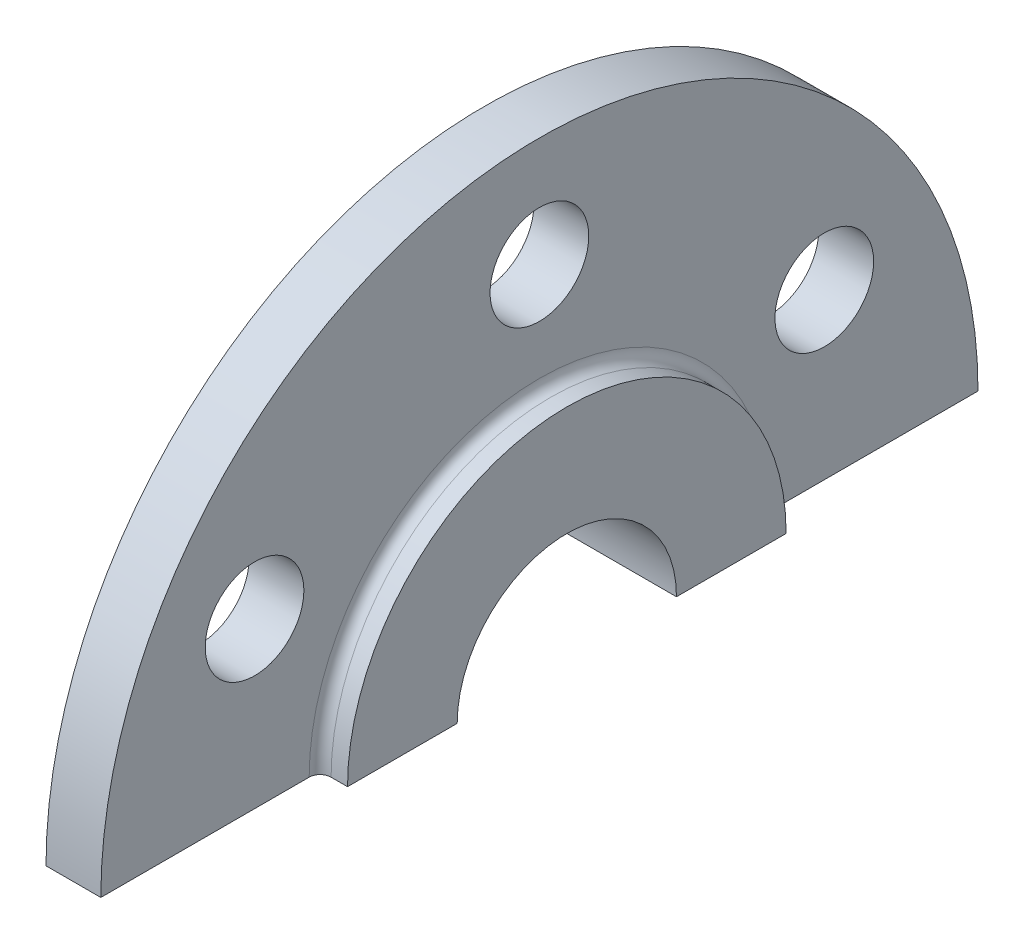
ISO-10303-21;
HEADER;
FILE_DESCRIPTION(('STEP AP214'),'2;1');
FILE_NAME('part.step','',(''),(''),'','','');
FILE_SCHEMA(('AUTOMOTIVE_DESIGN { 1 0 10303 214 1 1 1 1 }'));
ENDSEC;
DATA;
#1=APPLICATION_CONTEXT('core data for automotive mechanical design processes');
#2=APPLICATION_PROTOCOL_DEFINITION('international standard','automotive_design',2000,#1);
#3=PRODUCT_CONTEXT('',#1,'mechanical');
#4=PRODUCT('Part','Part','',(#3));
#5=PRODUCT_RELATED_PRODUCT_CATEGORY('part','',(#4));
#6=PRODUCT_DEFINITION_FORMATION('','',#4);
#7=PRODUCT_DEFINITION_CONTEXT('part definition',#1,'design');
#8=PRODUCT_DEFINITION('design','',#6,#7);
#9=PRODUCT_DEFINITION_SHAPE('','',#8);
#10=(LENGTH_UNIT() NAMED_UNIT(*) SI_UNIT(.MILLI.,.METRE.));
#11=(NAMED_UNIT(*) PLANE_ANGLE_UNIT() SI_UNIT($,.RADIAN.));
#12=(NAMED_UNIT(*) SI_UNIT($,.STERADIAN.) SOLID_ANGLE_UNIT());
#13=UNCERTAINTY_MEASURE_WITH_UNIT(LENGTH_MEASURE(1.E-05),#10,'distance_accuracy_value','');
#14=(GEOMETRIC_REPRESENTATION_CONTEXT(3) GLOBAL_UNCERTAINTY_ASSIGNED_CONTEXT((#13)) GLOBAL_UNIT_ASSIGNED_CONTEXT((#10,
#11,#12)) REPRESENTATION_CONTEXT('',''));
#15=CARTESIAN_POINT('',(0.,0.,0.));
#16=DIRECTION('',(0.,0.,1.));
#17=DIRECTION('',(1.,0.,0.));
#18=AXIS2_PLACEMENT_3D('',#15,#16,#17);
#19=CARTESIAN_POINT('',(-0.5,0.,0.));
#20=DIRECTION('',(-1.,0.,0.));
#21=DIRECTION('',(0.,0.,1.));
#22=AXIS2_PLACEMENT_3D('',#19,#20,#21);
#23=CYLINDRICAL_SURFACE('',#22,80.);
#24=CARTESIAN_POINT('',(-5.,0.,0.));
#25=DIRECTION('',(-1.,0.,0.));
#26=DIRECTION('',(0.,0.,1.));
#27=AXIS2_PLACEMENT_3D('',#24,#25,#26);
#28=CIRCLE('',#27,80.);
#29=CARTESIAN_POINT('',(-5.,-5.58637014214901E-13,80.));
#30=VERTEX_POINT('',#29);
#31=CARTESIAN_POINT('',(-5.,0.,-80.));
#32=VERTEX_POINT('',#31);
#33=EDGE_CURVE('E124',#30,#32,#28,.T.);
#34=ORIENTED_EDGE('',*,*,#33,.F.);
#35=DIRECTION('',(1.,0.,0.));
#36=VECTOR('',#35,1.);
#37=CARTESIAN_POINT('',(0.,-5.58637014214901E-13,80.));
#38=LINE('',#37,#36);
#39=CARTESIAN_POINT('',(5.,-5.58637014214901E-13,80.));
#40=VERTEX_POINT('',#39);
#41=EDGE_CURVE('E155',#30,#40,#38,.T.);
#42=ORIENTED_EDGE('',*,*,#41,.T.);
#43=CARTESIAN_POINT('',(5.,0.,0.));
#44=DIRECTION('',(-1.,0.,0.));
#45=DIRECTION('',(0.,0.,1.));
#46=AXIS2_PLACEMENT_3D('',#43,#44,#45);
#47=CIRCLE('',#46,80.);
#48=CARTESIAN_POINT('',(5.,0.,-80.));
#49=VERTEX_POINT('',#48);
#50=EDGE_CURVE('E133',#40,#49,#47,.T.);
#51=ORIENTED_EDGE('',*,*,#50,.T.);
#52=DIRECTION('',(1.,0.,0.));
#53=VECTOR('',#52,1.);
#54=CARTESIAN_POINT('',(0.,0.,-80.));
#55=LINE('',#54,#53);
#56=EDGE_CURVE('E119',#32,#49,#55,.T.);
#57=ORIENTED_EDGE('',*,*,#56,.F.);
#58=EDGE_LOOP('',(#34,#42,#51,#57));
#59=FACE_BOUND('',#58,.T.);
#60=ADVANCED_FACE('F41',(#59),#23,.T.);
#61=CARTESIAN_POINT('',(-5.,0.,0.));
#62=DIRECTION('',(-1.,0.,0.));
#63=DIRECTION('',(0.,0.,1.));
#64=AXIS2_PLACEMENT_3D('',#61,#62,#63);
#65=PLANE('',#64);
#66=CARTESIAN_POINT('',(-5.,29.9999999999999,51.9615242270664));
#67=DIRECTION('',(-1.,0.,0.));
#68=DIRECTION('',(0.,0.,1.));
#69=AXIS2_PLACEMENT_3D('',#66,#67,#68);
#70=CIRCLE('',#69,9.);
#71=CARTESIAN_POINT('',(-5.,29.9999999999999,60.9615242270664));
#72=VERTEX_POINT('',#71);
#73=EDGE_CURVE('E134',#72,#72,#70,.T.);
#74=ORIENTED_EDGE('',*,*,#73,.F.);
#75=EDGE_LOOP('',(#74));
#76=FACE_BOUND('',#75,.T.);
#77=CARTESIAN_POINT('',(-5.,60.,0.));
#78=DIRECTION('',(-1.,0.,0.));
#79=DIRECTION('',(0.,0.,1.));
#80=AXIS2_PLACEMENT_3D('',#77,#78,#79);
#81=CIRCLE('',#80,9.);
#82=CARTESIAN_POINT('',(-5.,60.,9.));
#83=VERTEX_POINT('',#82);
#84=EDGE_CURVE('E191',#83,#83,#81,.T.);
#85=ORIENTED_EDGE('',*,*,#84,.F.);
#86=EDGE_LOOP('',(#85));
#87=FACE_BOUND('',#86,.T.);
#88=CARTESIAN_POINT('',(-5.,29.9999999999999,-51.9615242270664));
#89=DIRECTION('',(-1.,0.,0.));
#90=DIRECTION('',(0.,0.,1.));
#91=AXIS2_PLACEMENT_3D('',#88,#89,#90);
#92=CIRCLE('',#91,9.00000000000001);
#93=CARTESIAN_POINT('',(-5.,29.9999999999999,-42.9615242270664));
#94=VERTEX_POINT('',#93);
#95=EDGE_CURVE('E187',#94,#94,#92,.T.);
#96=ORIENTED_EDGE('',*,*,#95,.F.);
#97=EDGE_LOOP('',(#96));
#98=FACE_BOUND('',#97,.T.);
#99=DIRECTION('',(0.,0.,-1.));
#100=VECTOR('',#99,1.);
#101=CARTESIAN_POINT('',(-5.,0.,0.));
#102=LINE('',#101,#100);
#103=CARTESIAN_POINT('',(-5.,0.,-42.));
#104=VERTEX_POINT('',#103);
#105=EDGE_CURVE('E114',#104,#32,#102,.T.);
#106=ORIENTED_EDGE('',*,*,#105,.F.);
#107=CARTESIAN_POINT('',(-5.,0.,0.));
#108=DIRECTION('',(-1.,0.,0.));
#109=DIRECTION('',(0.,0.,1.));
#110=AXIS2_PLACEMENT_3D('',#107,#108,#109);
#111=CIRCLE('',#110,42.);
#112=CARTESIAN_POINT('',(-5.,-2.93284432462823E-13,42.));
#113=VERTEX_POINT('',#112);
#114=EDGE_CURVE('E62',#104,#113,#111,.F.);
#115=ORIENTED_EDGE('',*,*,#114,.T.);
#116=DIRECTION('',(0.,0.,1.));
#117=VECTOR('',#116,1.);
#118=CARTESIAN_POINT('',(-5.,0.,0.));
#119=LINE('',#118,#117);
#120=EDGE_CURVE('E126',#113,#30,#119,.T.);
#121=ORIENTED_EDGE('',*,*,#120,.T.);
#122=ORIENTED_EDGE('',*,*,#33,.T.);
#123=EDGE_LOOP('',(#106,#115,#121,#122));
#124=FACE_BOUND('',#123,.T.);
#125=ADVANCED_FACE('F125',(#76,#87,#98,#124),#65,.T.);
#126=CARTESIAN_POINT('',(-0.5,0.,0.));
#127=DIRECTION('',(-1.,0.,0.));
#128=DIRECTION('',(0.,0.,1.));
#129=AXIS2_PLACEMENT_3D('',#126,#127,#128);
#130=CYLINDRICAL_SURFACE('',#129,40.);
#131=DIRECTION('',(1.,0.,0.));
#132=VECTOR('',#131,1.);
#133=CARTESIAN_POINT('',(0.,-2.79318507107451E-13,40.));
#134=LINE('',#133,#132);
#135=CARTESIAN_POINT('',(-10.,-2.79318507107451E-13,40.));
#136=VERTEX_POINT('',#135);
#137=CARTESIAN_POINT('',(-7.,-2.79318507107451E-13,40.));
#138=VERTEX_POINT('',#137);
#139=EDGE_CURVE('E158',#136,#138,#134,.T.);
#140=ORIENTED_EDGE('',*,*,#139,.T.);
#141=CARTESIAN_POINT('',(-7.,0.,0.));
#142=DIRECTION('',(-1.,0.,0.));
#143=DIRECTION('',(0.,0.,1.));
#144=AXIS2_PLACEMENT_3D('',#141,#142,#143);
#145=CIRCLE('',#144,40.);
#146=CARTESIAN_POINT('',(-7.,0.,-40.));
#147=VERTEX_POINT('',#146);
#148=EDGE_CURVE('E198',#138,#147,#145,.T.);
#149=ORIENTED_EDGE('',*,*,#148,.T.);
#150=DIRECTION('',(1.,0.,0.));
#151=VECTOR('',#150,1.);
#152=CARTESIAN_POINT('',(0.,0.,-40.));
#153=LINE('',#152,#151);
#154=CARTESIAN_POINT('',(-10.,0.,-40.));
#155=VERTEX_POINT('',#154);
#156=EDGE_CURVE('E121',#155,#147,#153,.T.);
#157=ORIENTED_EDGE('',*,*,#156,.F.);
#158=CARTESIAN_POINT('',(-10.,0.,0.));
#159=DIRECTION('',(-1.,0.,0.));
#160=DIRECTION('',(0.,0.,1.));
#161=AXIS2_PLACEMENT_3D('',#158,#159,#160);
#162=CIRCLE('',#161,40.);
#163=EDGE_CURVE('E131',#136,#155,#162,.T.);
#164=ORIENTED_EDGE('',*,*,#163,.F.);
#165=EDGE_LOOP('',(#140,#149,#157,#164));
#166=FACE_BOUND('',#165,.T.);
#167=ADVANCED_FACE('F235',(#166),#130,.T.);
#168=CARTESIAN_POINT('',(-10.,0.,0.));
#169=DIRECTION('',(-1.,0.,0.));
#170=DIRECTION('',(0.,0.,1.));
#171=AXIS2_PLACEMENT_3D('',#168,#169,#170);
#172=PLANE('',#171);
#173=CARTESIAN_POINT('',(-10.,0.,0.));
#174=DIRECTION('',(-1.,0.,0.));
#175=DIRECTION('',(0.,0.,1.));
#176=AXIS2_PLACEMENT_3D('',#173,#174,#175);
#177=CIRCLE('',#176,20.);
#178=CARTESIAN_POINT('',(-10.,-1.39659253553725E-13,20.));
#179=VERTEX_POINT('',#178);
#180=CARTESIAN_POINT('',(-10.,0.,-20.));
#181=VERTEX_POINT('',#180);
#182=EDGE_CURVE('E181',#179,#181,#177,.T.);
#183=ORIENTED_EDGE('',*,*,#182,.F.);
#184=DIRECTION('',(0.,0.,1.));
#185=VECTOR('',#184,1.);
#186=CARTESIAN_POINT('',(-9.99999999999999,0.,0.));
#187=LINE('',#186,#185);
#188=EDGE_CURVE('E161',#179,#136,#187,.T.);
#189=ORIENTED_EDGE('',*,*,#188,.T.);
#190=ORIENTED_EDGE('',*,*,#163,.T.);
#191=DIRECTION('',(0.,0.,-1.));
#192=VECTOR('',#191,1.);
#193=CARTESIAN_POINT('',(-9.99999999999999,0.,0.));
#194=LINE('',#193,#192);
#195=EDGE_CURVE('E142',#181,#155,#194,.T.);
#196=ORIENTED_EDGE('',*,*,#195,.F.);
#197=EDGE_LOOP('',(#183,#189,#190,#196));
#198=FACE_BOUND('',#197,.T.);
#199=ADVANCED_FACE('F231',(#198),#172,.T.);
#200=CARTESIAN_POINT('',(-0.5,0.,0.));
#201=DIRECTION('',(-1.,0.,0.));
#202=DIRECTION('',(0.,0.,1.));
#203=AXIS2_PLACEMENT_3D('',#200,#201,#202);
#204=CYLINDRICAL_SURFACE('',#203,20.);
#205=CARTESIAN_POINT('',(10.,0.,0.));
#206=DIRECTION('',(-1.,0.,0.));
#207=DIRECTION('',(0.,0.,1.));
#208=AXIS2_PLACEMENT_3D('',#205,#206,#207);
#209=CIRCLE('',#208,20.);
#210=CARTESIAN_POINT('',(10.,-1.39659253553725E-13,20.));
#211=VERTEX_POINT('',#210);
#212=CARTESIAN_POINT('',(10.,0.,-20.));
#213=VERTEX_POINT('',#212);
#214=EDGE_CURVE('E179',#211,#213,#209,.T.);
#215=ORIENTED_EDGE('',*,*,#214,.F.);
#216=DIRECTION('',(-1.,0.,0.));
#217=VECTOR('',#216,1.);
#218=CARTESIAN_POINT('',(0.,-1.39659253553725E-13,20.));
#219=LINE('',#218,#217);
#220=EDGE_CURVE('E164',#211,#179,#219,.T.);
#221=ORIENTED_EDGE('',*,*,#220,.T.);
#222=ORIENTED_EDGE('',*,*,#182,.T.);
#223=DIRECTION('',(-1.,0.,0.));
#224=VECTOR('',#223,1.);
#225=CARTESIAN_POINT('',(0.,0.,-20.));
#226=LINE('',#225,#224);
#227=EDGE_CURVE('E145',#213,#181,#226,.T.);
#228=ORIENTED_EDGE('',*,*,#227,.F.);
#229=EDGE_LOOP('',(#215,#221,#222,#228));
#230=FACE_BOUND('',#229,.T.);
#231=ADVANCED_FACE('F227',(#230),#204,.F.);
#232=CARTESIAN_POINT('',(10.,0.,0.));
#233=DIRECTION('',(1.,0.,0.));
#234=DIRECTION('',(0.,0.,-1.));
#235=AXIS2_PLACEMENT_3D('',#232,#233,#234);
#236=PLANE('',#235);
#237=CARTESIAN_POINT('',(10.,0.,0.));
#238=DIRECTION('',(-1.,0.,0.));
#239=DIRECTION('',(0.,0.,1.));
#240=AXIS2_PLACEMENT_3D('',#237,#238,#239);
#241=CIRCLE('',#240,40.);
#242=CARTESIAN_POINT('',(10.,-2.79318507107451E-13,40.));
#243=VERTEX_POINT('',#242);
#244=CARTESIAN_POINT('',(10.,0.,-40.));
#245=VERTEX_POINT('',#244);
#246=EDGE_CURVE('E176',#243,#245,#241,.T.);
#247=ORIENTED_EDGE('',*,*,#246,.F.);
#248=DIRECTION('',(0.,0.,-1.));
#249=VECTOR('',#248,1.);
#250=CARTESIAN_POINT('',(10.,0.,0.));
#251=LINE('',#250,#249);
#252=EDGE_CURVE('E167',#243,#211,#251,.T.);
#253=ORIENTED_EDGE('',*,*,#252,.T.);
#254=ORIENTED_EDGE('',*,*,#214,.T.);
#255=DIRECTION('',(0.,0.,1.));
#256=VECTOR('',#255,1.);
#257=CARTESIAN_POINT('',(10.,0.,0.));
#258=LINE('',#257,#256);
#259=EDGE_CURVE('E148',#245,#213,#258,.T.);
#260=ORIENTED_EDGE('',*,*,#259,.F.);
#261=EDGE_LOOP('',(#247,#253,#254,#260));
#262=FACE_BOUND('',#261,.T.);
#263=ADVANCED_FACE('F223',(#262),#236,.T.);
#264=CARTESIAN_POINT('',(-0.5,0.,0.));
#265=DIRECTION('',(-1.,0.,0.));
#266=DIRECTION('',(0.,0.,1.));
#267=AXIS2_PLACEMENT_3D('',#264,#265,#266);
#268=CYLINDRICAL_SURFACE('',#267,40.);
#269=DIRECTION('',(1.,0.,0.));
#270=VECTOR('',#269,1.);
#271=CARTESIAN_POINT('',(0.,0.,-40.));
#272=LINE('',#271,#270);
#273=CARTESIAN_POINT('',(7.,0.,-40.));
#274=VERTEX_POINT('',#273);
#275=EDGE_CURVE('E151',#274,#245,#272,.T.);
#276=ORIENTED_EDGE('',*,*,#275,.F.);
#277=CARTESIAN_POINT('',(7.,0.,0.));
#278=DIRECTION('',(1.,0.,0.));
#279=DIRECTION('',(0.,0.,-1.));
#280=AXIS2_PLACEMENT_3D('',#277,#278,#279);
#281=CIRCLE('',#280,40.);
#282=CARTESIAN_POINT('',(7.,-2.79318507107451E-13,40.));
#283=VERTEX_POINT('',#282);
#284=EDGE_CURVE('E196',#274,#283,#281,.T.);
#285=ORIENTED_EDGE('',*,*,#284,.T.);
#286=DIRECTION('',(1.,0.,0.));
#287=VECTOR('',#286,1.);
#288=CARTESIAN_POINT('',(0.,-2.79318507107451E-13,40.));
#289=LINE('',#288,#287);
#290=EDGE_CURVE('E170',#283,#243,#289,.T.);
#291=ORIENTED_EDGE('',*,*,#290,.T.);
#292=ORIENTED_EDGE('',*,*,#246,.T.);
#293=EDGE_LOOP('',(#276,#285,#291,#292));
#294=FACE_BOUND('',#293,.T.);
#295=ADVANCED_FACE('F219',(#294),#268,.T.);
#296=CARTESIAN_POINT('',(5.,0.,0.));
#297=DIRECTION('',(1.,0.,0.));
#298=DIRECTION('',(0.,0.,-1.));
#299=AXIS2_PLACEMENT_3D('',#296,#297,#298);
#300=PLANE('',#299);
#301=CARTESIAN_POINT('',(5.,29.9999999999999,51.9615242270664));
#302=DIRECTION('',(1.,0.,0.));
#303=DIRECTION('',(0.,0.,-1.));
#304=AXIS2_PLACEMENT_3D('',#301,#302,#303);
#305=CIRCLE('',#304,9.);
#306=CARTESIAN_POINT('',(5.,29.9999999999999,42.9615242270664));
#307=VERTEX_POINT('',#306);
#308=EDGE_CURVE('E137',#307,#307,#305,.T.);
#309=ORIENTED_EDGE('',*,*,#308,.F.);
#310=EDGE_LOOP('',(#309));
#311=FACE_BOUND('',#310,.T.);
#312=CARTESIAN_POINT('',(5.,60.,0.));
#313=DIRECTION('',(1.,0.,0.));
#314=DIRECTION('',(0.,0.,-1.));
#315=AXIS2_PLACEMENT_3D('',#312,#313,#314);
#316=CIRCLE('',#315,9.);
#317=CARTESIAN_POINT('',(5.,60.,-9.));
#318=VERTEX_POINT('',#317);
#319=EDGE_CURVE('E188',#318,#318,#316,.T.);
#320=ORIENTED_EDGE('',*,*,#319,.F.);
#321=EDGE_LOOP('',(#320));
#322=FACE_BOUND('',#321,.T.);
#323=CARTESIAN_POINT('',(5.,29.9999999999999,-51.9615242270664));
#324=DIRECTION('',(1.,0.,0.));
#325=DIRECTION('',(0.,0.,-1.));
#326=AXIS2_PLACEMENT_3D('',#323,#324,#325);
#327=CIRCLE('',#326,9.00000000000001);
#328=CARTESIAN_POINT('',(5.,29.9999999999999,-60.9615242270664));
#329=VERTEX_POINT('',#328);
#330=EDGE_CURVE('E184',#329,#329,#327,.T.);
#331=ORIENTED_EDGE('',*,*,#330,.F.);
#332=EDGE_LOOP('',(#331));
#333=FACE_BOUND('',#332,.T.);
#334=DIRECTION('',(0.,0.,-1.));
#335=VECTOR('',#334,1.);
#336=CARTESIAN_POINT('',(5.00000000000001,0.,0.));
#337=LINE('',#336,#335);
#338=CARTESIAN_POINT('',(5.00000000000001,-2.93284432462823E-13,42.));
#339=VERTEX_POINT('',#338);
#340=EDGE_CURVE('E172',#40,#339,#337,.T.);
#341=ORIENTED_EDGE('',*,*,#340,.T.);
#342=CARTESIAN_POINT('',(5.,0.,0.));
#343=DIRECTION('',(1.,0.,0.));
#344=DIRECTION('',(0.,0.,-1.));
#345=AXIS2_PLACEMENT_3D('',#342,#343,#344);
#346=CIRCLE('',#345,42.);
#347=CARTESIAN_POINT('',(5.00000000000001,0.,-42.));
#348=VERTEX_POINT('',#347);
#349=EDGE_CURVE('E130',#339,#348,#346,.F.);
#350=ORIENTED_EDGE('',*,*,#349,.T.);
#351=DIRECTION('',(0.,0.,1.));
#352=VECTOR('',#351,1.);
#353=CARTESIAN_POINT('',(5.00000000000001,0.,0.));
#354=LINE('',#353,#352);
#355=EDGE_CURVE('E153',#49,#348,#354,.T.);
#356=ORIENTED_EDGE('',*,*,#355,.F.);
#357=ORIENTED_EDGE('',*,*,#50,.F.);
#358=EDGE_LOOP('',(#341,#350,#356,#357));
#359=FACE_BOUND('',#358,.T.);
#360=ADVANCED_FACE('F215',(#311,#322,#333,#359),#300,.T.);
#361=CARTESIAN_POINT('',(0.,0.,0.));
#362=DIRECTION('',(0.,-1.,0.));
#363=DIRECTION('',(0.,0.,-1.));
#364=AXIS2_PLACEMENT_3D('',#361,#362,#363);
#365=PLANE('',#364);
#366=ORIENTED_EDGE('',*,*,#41,.F.);
#367=ORIENTED_EDGE('',*,*,#120,.F.);
#368=CARTESIAN_POINT('',(-7.,-2.93284432462823E-13,42.));
#369=DIRECTION('',(0.,-1.,0.));
#370=DIRECTION('',(0.,0.,-1.));
#371=AXIS2_PLACEMENT_3D('',#368,#369,#370);
#372=CIRCLE('',#371,2.);
#373=EDGE_CURVE('E11',#113,#138,#372,.F.);
#374=ORIENTED_EDGE('',*,*,#373,.T.);
#375=ORIENTED_EDGE('',*,*,#139,.F.);
#376=ORIENTED_EDGE('',*,*,#188,.F.);
#377=ORIENTED_EDGE('',*,*,#220,.F.);
#378=ORIENTED_EDGE('',*,*,#252,.F.);
#379=ORIENTED_EDGE('',*,*,#290,.F.);
#380=CARTESIAN_POINT('',(7.,-2.93284432462823E-13,42.));
#381=DIRECTION('',(0.,-1.,0.));
#382=DIRECTION('',(0.,0.,-1.));
#383=AXIS2_PLACEMENT_3D('',#380,#381,#382);
#384=CIRCLE('',#383,2.);
#385=EDGE_CURVE('E204',#283,#339,#384,.F.);
#386=ORIENTED_EDGE('',*,*,#385,.T.);
#387=ORIENTED_EDGE('',*,*,#340,.F.);
#388=EDGE_LOOP('',(#366,#367,#374,#375,#376,#377,#378,#379,#386,#387));
#389=FACE_BOUND('',#388,.T.);
#390=ADVANCED_FACE('F209',(#389),#365,.T.);
#391=CARTESIAN_POINT('',(0.,0.,0.));
#392=DIRECTION('',(0.,1.,0.));
#393=DIRECTION('',(0.,0.,1.));
#394=AXIS2_PLACEMENT_3D('',#391,#392,#393);
#395=PLANE('',#394);
#396=ORIENTED_EDGE('',*,*,#56,.T.);
#397=ORIENTED_EDGE('',*,*,#355,.T.);
#398=CARTESIAN_POINT('',(7.,0.,-42.));
#399=DIRECTION('',(0.,1.,0.));
#400=DIRECTION('',(0.,0.,1.));
#401=AXIS2_PLACEMENT_3D('',#398,#399,#400);
#402=CIRCLE('',#401,2.);
#403=EDGE_CURVE('E202',#348,#274,#402,.T.);
#404=ORIENTED_EDGE('',*,*,#403,.T.);
#405=ORIENTED_EDGE('',*,*,#275,.T.);
#406=ORIENTED_EDGE('',*,*,#259,.T.);
#407=ORIENTED_EDGE('',*,*,#227,.T.);
#408=ORIENTED_EDGE('',*,*,#195,.T.);
#409=ORIENTED_EDGE('',*,*,#156,.T.);
#410=CARTESIAN_POINT('',(-7.,0.,-42.));
#411=DIRECTION('',(0.,1.,0.));
#412=DIRECTION('',(0.,0.,1.));
#413=AXIS2_PLACEMENT_3D('',#410,#411,#412);
#414=CIRCLE('',#413,2.);
#415=EDGE_CURVE('E49',#147,#104,#414,.T.);
#416=ORIENTED_EDGE('',*,*,#415,.T.);
#417=ORIENTED_EDGE('',*,*,#105,.T.);
#418=EDGE_LOOP('',(#396,#397,#404,#405,#406,#407,#408,#409,#416,#417));
#419=FACE_BOUND('',#418,.T.);
#420=ADVANCED_FACE('F116',(#419),#395,.F.);
#421=CARTESIAN_POINT('',(-10.,29.9999999999999,-51.9615242270664));
#422=DIRECTION('',(1.,0.,0.));
#423=DIRECTION('',(0.,0.,-1.));
#424=AXIS2_PLACEMENT_3D('',#421,#422,#423);
#425=CYLINDRICAL_SURFACE('',#424,9.00000000000001);
#426=ORIENTED_EDGE('',*,*,#95,.T.);
#427=EDGE_LOOP('',(#426));
#428=FACE_BOUND('',#427,.T.);
#429=ORIENTED_EDGE('',*,*,#330,.T.);
#430=EDGE_LOOP('',(#429));
#431=FACE_BOUND('',#430,.T.);
#432=ADVANCED_FACE('F296',(#428,#431),#425,.F.);
#433=CARTESIAN_POINT('',(-10.,60.,0.));
#434=DIRECTION('',(1.,0.,0.));
#435=DIRECTION('',(0.,0.,-1.));
#436=AXIS2_PLACEMENT_3D('',#433,#434,#435);
#437=CYLINDRICAL_SURFACE('',#436,9.);
#438=ORIENTED_EDGE('',*,*,#84,.T.);
#439=EDGE_LOOP('',(#438));
#440=FACE_BOUND('',#439,.T.);
#441=ORIENTED_EDGE('',*,*,#319,.T.);
#442=EDGE_LOOP('',(#441));
#443=FACE_BOUND('',#442,.T.);
#444=ADVANCED_FACE('F315',(#440,#443),#437,.F.);
#445=CARTESIAN_POINT('',(-10.,29.9999999999999,51.9615242270664));
#446=DIRECTION('',(1.,0.,0.));
#447=DIRECTION('',(0.,0.,-1.));
#448=AXIS2_PLACEMENT_3D('',#445,#446,#447);
#449=CYLINDRICAL_SURFACE('',#448,9.);
#450=ORIENTED_EDGE('',*,*,#73,.T.);
#451=EDGE_LOOP('',(#450));
#452=FACE_BOUND('',#451,.T.);
#453=ORIENTED_EDGE('',*,*,#308,.T.);
#454=EDGE_LOOP('',(#453));
#455=FACE_BOUND('',#454,.T.);
#456=ADVANCED_FACE('F243',(#452,#455),#449,.F.);
#457=CARTESIAN_POINT('',(7.,0.,0.));
#458=DIRECTION('',(1.,0.,0.));
#459=DIRECTION('',(0.,0.,-1.));
#460=AXIS2_PLACEMENT_3D('',#457,#458,#459);
#461=TOROIDAL_SURFACE('',#460,42.,2.);
#462=ORIENTED_EDGE('',*,*,#385,.F.);
#463=ORIENTED_EDGE('',*,*,#284,.F.);
#464=ORIENTED_EDGE('',*,*,#403,.F.);
#465=ORIENTED_EDGE('',*,*,#349,.F.);
#466=EDGE_LOOP('',(#462,#463,#464,#465));
#467=FACE_BOUND('',#466,.T.);
#468=ADVANCED_FACE('F216',(#467),#461,.F.);
#469=CARTESIAN_POINT('',(-7.,0.,0.));
#470=DIRECTION('',(-1.,0.,0.));
#471=DIRECTION('',(0.,0.,1.));
#472=AXIS2_PLACEMENT_3D('',#469,#470,#471);
#473=TOROIDAL_SURFACE('',#472,42.,2.);
#474=ORIENTED_EDGE('',*,*,#373,.F.);
#475=ORIENTED_EDGE('',*,*,#114,.F.);
#476=ORIENTED_EDGE('',*,*,#415,.F.);
#477=ORIENTED_EDGE('',*,*,#148,.F.);
#478=EDGE_LOOP('',(#474,#475,#476,#477));
#479=FACE_BOUND('',#478,.T.);
#480=ADVANCED_FACE('F43',(#479),#473,.F.);
#481=CLOSED_SHELL('',(#60,#125,#167,#199,#231,#263,#295,#360,#390,#420,#432,#444,#456,#468,#480));
#482=MANIFOLD_SOLID_BREP('B2',#481);
#483=ADVANCED_BREP_SHAPE_REPRESENTATION('',(#18,#482),#14);
#484=SHAPE_DEFINITION_REPRESENTATION(#9,#483);
ENDSEC;
END-ISO-10303-21;
